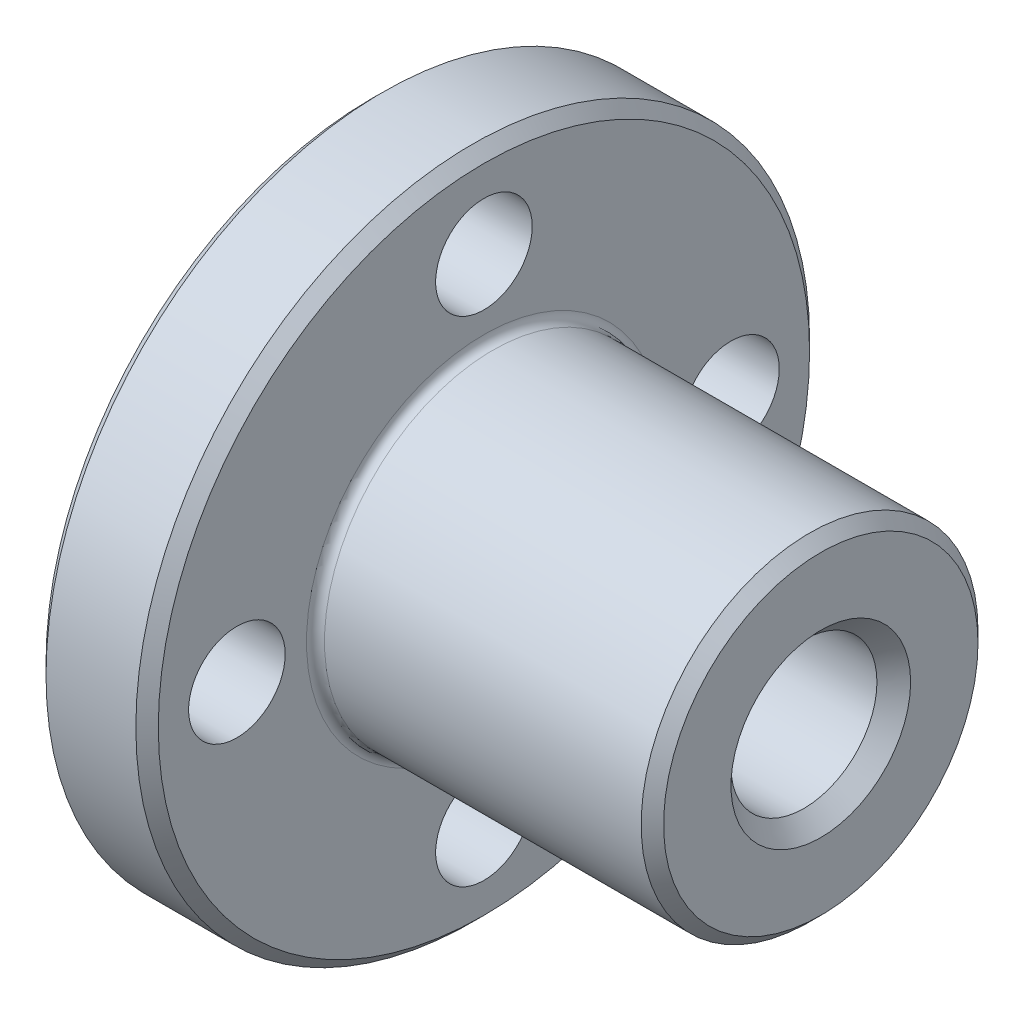
ISO-10303-21;
HEADER;
FILE_DESCRIPTION(('STEP AP214'),'2;1');
FILE_NAME('part.step','',(''),(''),'','','');
FILE_SCHEMA(('AUTOMOTIVE_DESIGN { 1 0 10303 214 1 1 1 1 }'));
ENDSEC;
DATA;
#1=APPLICATION_CONTEXT('core data for automotive mechanical design processes');
#2=APPLICATION_PROTOCOL_DEFINITION('international standard','automotive_design',2000,#1);
#3=PRODUCT_CONTEXT('',#1,'mechanical');
#4=PRODUCT('Part','Part','',(#3));
#5=PRODUCT_RELATED_PRODUCT_CATEGORY('part','',(#4));
#6=PRODUCT_DEFINITION_FORMATION('','',#4);
#7=PRODUCT_DEFINITION_CONTEXT('part definition',#1,'design');
#8=PRODUCT_DEFINITION('design','',#6,#7);
#9=PRODUCT_DEFINITION_SHAPE('','',#8);
#10=(LENGTH_UNIT() NAMED_UNIT(*) SI_UNIT(.MILLI.,.METRE.));
#11=(NAMED_UNIT(*) PLANE_ANGLE_UNIT() SI_UNIT($,.RADIAN.));
#12=(NAMED_UNIT(*) SI_UNIT($,.STERADIAN.) SOLID_ANGLE_UNIT());
#13=UNCERTAINTY_MEASURE_WITH_UNIT(LENGTH_MEASURE(1.E-05),#10,'distance_accuracy_value','');
#14=(GEOMETRIC_REPRESENTATION_CONTEXT(3) GLOBAL_UNCERTAINTY_ASSIGNED_CONTEXT((#13)) GLOBAL_UNIT_ASSIGNED_CONTEXT((#10,
#11,#12)) REPRESENTATION_CONTEXT('',''));
#15=CARTESIAN_POINT('',(0.,0.,0.));
#16=DIRECTION('',(0.,0.,1.));
#17=DIRECTION('',(1.,0.,0.));
#18=AXIS2_PLACEMENT_3D('',#15,#16,#17);
#19=CARTESIAN_POINT('',(0.,0.,0.));
#20=DIRECTION('',(-1.,0.,0.));
#21=DIRECTION('',(0.,0.,1.));
#22=AXIS2_PLACEMENT_3D('',#19,#20,#21);
#23=PLANE('',#22);
#24=CARTESIAN_POINT('',(0.,0.,0.));
#25=DIRECTION('',(-1.,0.,0.));
#26=DIRECTION('',(0.,0.,1.));
#27=AXIS2_PLACEMENT_3D('',#24,#25,#26);
#28=CIRCLE('',#27,14.5000000000013);
#29=CARTESIAN_POINT('',(0.,0.,14.5000000000013));
#30=VERTEX_POINT('',#29);
#31=EDGE_CURVE('E60',#30,#30,#28,.T.);
#32=ORIENTED_EDGE('',*,*,#31,.T.);
#33=EDGE_LOOP('',(#32));
#34=FACE_BOUND('',#33,.T.);
#35=CARTESIAN_POINT('',(0.,0.,0.));
#36=DIRECTION('',(-1.,0.,0.));
#37=DIRECTION('',(0.,0.,1.));
#38=AXIS2_PLACEMENT_3D('',#35,#36,#37);
#39=CIRCLE('',#38,4.00000000000191);
#40=CARTESIAN_POINT('',(0.,0.,4.00000000000191));
#41=VERTEX_POINT('',#40);
#42=EDGE_CURVE('E69',#41,#41,#39,.F.);
#43=ORIENTED_EDGE('',*,*,#42,.T.);
#44=EDGE_LOOP('',(#43));
#45=FACE_BOUND('',#44,.T.);
#46=CARTESIAN_POINT('',(0.,0.,11.));
#47=DIRECTION('',(1.,0.,0.));
#48=DIRECTION('',(0.,0.,-1.));
#49=AXIS2_PLACEMENT_3D('',#46,#47,#48);
#50=CIRCLE('',#49,2.14999999999999);
#51=CARTESIAN_POINT('',(0.,0.,8.85000000000001));
#52=VERTEX_POINT('',#51);
#53=EDGE_CURVE('E99',#52,#52,#50,.T.);
#54=ORIENTED_EDGE('',*,*,#53,.T.);
#55=EDGE_LOOP('',(#54));
#56=FACE_BOUND('',#55,.T.);
#57=CARTESIAN_POINT('',(0.,0.,-11.));
#58=DIRECTION('',(1.,0.,0.));
#59=DIRECTION('',(0.,0.,-1.));
#60=AXIS2_PLACEMENT_3D('',#57,#58,#59);
#61=CIRCLE('',#60,2.14999999999999);
#62=CARTESIAN_POINT('',(0.,0.,-13.15));
#63=VERTEX_POINT('',#62);
#64=EDGE_CURVE('E93',#63,#63,#61,.T.);
#65=ORIENTED_EDGE('',*,*,#64,.T.);
#66=EDGE_LOOP('',(#65));
#67=FACE_BOUND('',#66,.T.);
#68=CARTESIAN_POINT('',(0.,-11.,0.));
#69=DIRECTION('',(1.,0.,0.));
#70=DIRECTION('',(0.,0.,-1.));
#71=AXIS2_PLACEMENT_3D('',#68,#69,#70);
#72=CIRCLE('',#71,2.14999999999999);
#73=CARTESIAN_POINT('',(0.,-11.,-2.14999999999999));
#74=VERTEX_POINT('',#73);
#75=EDGE_CURVE('E87',#74,#74,#72,.T.);
#76=ORIENTED_EDGE('',*,*,#75,.T.);
#77=EDGE_LOOP('',(#76));
#78=FACE_BOUND('',#77,.T.);
#79=CARTESIAN_POINT('',(0.,11.,0.));
#80=DIRECTION('',(1.,0.,0.));
#81=DIRECTION('',(0.,0.,-1.));
#82=AXIS2_PLACEMENT_3D('',#79,#80,#81);
#83=CIRCLE('',#82,2.14999999999999);
#84=CARTESIAN_POINT('',(0.,11.,-2.14999999999999));
#85=VERTEX_POINT('',#84);
#86=EDGE_CURVE('E81',#85,#85,#83,.T.);
#87=ORIENTED_EDGE('',*,*,#86,.T.);
#88=EDGE_LOOP('',(#87));
#89=FACE_BOUND('',#88,.T.);
#90=ADVANCED_FACE('F37',(#34,#45,#56,#67,#78,#89),#23,.T.);
#91=CARTESIAN_POINT('',(5.,0.,0.));
#92=DIRECTION('',(-1.,0.,0.));
#93=DIRECTION('',(0.,0.,1.));
#94=AXIS2_PLACEMENT_3D('',#91,#92,#93);
#95=CYLINDRICAL_SURFACE('',#94,15.);
#96=CARTESIAN_POINT('',(0.500000000001295,0.,0.));
#97=DIRECTION('',(-1.,0.,0.));
#98=DIRECTION('',(0.,0.,1.));
#99=AXIS2_PLACEMENT_3D('',#96,#97,#98);
#100=CIRCLE('',#99,15.);
#101=CARTESIAN_POINT('',(0.500000000001295,0.,15.));
#102=VERTEX_POINT('',#101);
#103=EDGE_CURVE('E52',#102,#102,#100,.F.);
#104=ORIENTED_EDGE('',*,*,#103,.T.);
#105=EDGE_LOOP('',(#104));
#106=FACE_BOUND('',#105,.T.);
#107=CARTESIAN_POINT('',(4.50000000000127,0.,0.));
#108=DIRECTION('',(1.,0.,0.));
#109=DIRECTION('',(0.,0.,-1.));
#110=AXIS2_PLACEMENT_3D('',#107,#108,#109);
#111=CIRCLE('',#110,15.);
#112=CARTESIAN_POINT('',(4.50000000000127,0.,-15.));
#113=VERTEX_POINT('',#112);
#114=EDGE_CURVE('E57',#113,#113,#111,.F.);
#115=ORIENTED_EDGE('',*,*,#114,.T.);
#116=EDGE_LOOP('',(#115));
#117=FACE_BOUND('',#116,.T.);
#118=ADVANCED_FACE('F112',(#106,#117),#95,.T.);
#119=CARTESIAN_POINT('',(5.,15.,0.));
#120=DIRECTION('',(1.,0.,0.));
#121=DIRECTION('',(0.,0.,-1.));
#122=AXIS2_PLACEMENT_3D('',#119,#120,#121);
#123=PLANE('',#122);
#124=CARTESIAN_POINT('',(5.,0.,0.));
#125=DIRECTION('',(1.,0.,0.));
#126=DIRECTION('',(0.,0.,-1.));
#127=AXIS2_PLACEMENT_3D('',#124,#125,#126);
#128=CIRCLE('',#127,7.9);
#129=CARTESIAN_POINT('',(5.,0.,-7.9));
#130=VERTEX_POINT('',#129);
#131=EDGE_CURVE('E10',#130,#130,#128,.F.);
#132=ORIENTED_EDGE('',*,*,#131,.T.);
#133=EDGE_LOOP('',(#132));
#134=FACE_BOUND('',#133,.T.);
#135=CARTESIAN_POINT('',(5.,0.,0.));
#136=DIRECTION('',(1.,0.,0.));
#137=DIRECTION('',(0.,0.,-1.));
#138=AXIS2_PLACEMENT_3D('',#135,#136,#137);
#139=CIRCLE('',#138,14.4999999999987);
#140=CARTESIAN_POINT('',(5.,0.,-14.4999999999987));
#141=VERTEX_POINT('',#140);
#142=EDGE_CURVE('E48',#141,#141,#139,.T.);
#143=ORIENTED_EDGE('',*,*,#142,.T.);
#144=EDGE_LOOP('',(#143));
#145=FACE_BOUND('',#144,.T.);
#146=CARTESIAN_POINT('',(5.,0.,11.));
#147=DIRECTION('',(1.,0.,0.));
#148=DIRECTION('',(0.,0.,-1.));
#149=AXIS2_PLACEMENT_3D('',#146,#147,#148);
#150=CIRCLE('',#149,2.14999999999999);
#151=CARTESIAN_POINT('',(5.,0.,8.85000000000001));
#152=VERTEX_POINT('',#151);
#153=EDGE_CURVE('E102',#152,#152,#150,.T.);
#154=ORIENTED_EDGE('',*,*,#153,.F.);
#155=EDGE_LOOP('',(#154));
#156=FACE_BOUND('',#155,.T.);
#157=CARTESIAN_POINT('',(5.,0.,-11.));
#158=DIRECTION('',(1.,0.,0.));
#159=DIRECTION('',(0.,0.,-1.));
#160=AXIS2_PLACEMENT_3D('',#157,#158,#159);
#161=CIRCLE('',#160,2.14999999999999);
#162=CARTESIAN_POINT('',(5.,0.,-13.15));
#163=VERTEX_POINT('',#162);
#164=EDGE_CURVE('E96',#163,#163,#161,.T.);
#165=ORIENTED_EDGE('',*,*,#164,.F.);
#166=EDGE_LOOP('',(#165));
#167=FACE_BOUND('',#166,.T.);
#168=CARTESIAN_POINT('',(5.,-11.,0.));
#169=DIRECTION('',(1.,0.,0.));
#170=DIRECTION('',(0.,0.,-1.));
#171=AXIS2_PLACEMENT_3D('',#168,#169,#170);
#172=CIRCLE('',#171,2.14999999999999);
#173=CARTESIAN_POINT('',(5.,-11.,-2.14999999999999));
#174=VERTEX_POINT('',#173);
#175=EDGE_CURVE('E90',#174,#174,#172,.T.);
#176=ORIENTED_EDGE('',*,*,#175,.F.);
#177=EDGE_LOOP('',(#176));
#178=FACE_BOUND('',#177,.T.);
#179=CARTESIAN_POINT('',(5.,11.,0.));
#180=DIRECTION('',(1.,0.,0.));
#181=DIRECTION('',(0.,0.,-1.));
#182=AXIS2_PLACEMENT_3D('',#179,#180,#181);
#183=CIRCLE('',#182,2.14999999999999);
#184=CARTESIAN_POINT('',(5.,11.,-2.14999999999999));
#185=VERTEX_POINT('',#184);
#186=EDGE_CURVE('E84',#185,#185,#183,.T.);
#187=ORIENTED_EDGE('',*,*,#186,.F.);
#188=EDGE_LOOP('',(#187));
#189=FACE_BOUND('',#188,.T.);
#190=ADVANCED_FACE('F108',(#134,#145,#156,#167,#178,#189),#123,.T.);
#191=CARTESIAN_POINT('',(20.,0.,0.));
#192=DIRECTION('',(-1.,0.,0.));
#193=DIRECTION('',(0.,0.,1.));
#194=AXIS2_PLACEMENT_3D('',#191,#192,#193);
#195=CYLINDRICAL_SURFACE('',#194,7.5);
#196=CARTESIAN_POINT('',(5.4,0.,0.));
#197=DIRECTION('',(1.,0.,0.));
#198=DIRECTION('',(0.,0.,-1.));
#199=AXIS2_PLACEMENT_3D('',#196,#197,#198);
#200=CIRCLE('',#199,7.5);
#201=CARTESIAN_POINT('',(5.4,0.,-7.5));
#202=VERTEX_POINT('',#201);
#203=EDGE_CURVE('E44',#202,#202,#200,.T.);
#204=ORIENTED_EDGE('',*,*,#203,.T.);
#205=EDGE_LOOP('',(#204));
#206=FACE_BOUND('',#205,.T.);
#207=CARTESIAN_POINT('',(19.4999999999987,0.,0.));
#208=DIRECTION('',(1.,0.,0.));
#209=DIRECTION('',(0.,0.,-1.));
#210=AXIS2_PLACEMENT_3D('',#207,#208,#209);
#211=CIRCLE('',#210,7.5);
#212=CARTESIAN_POINT('',(19.4999999999987,0.,-7.5));
#213=VERTEX_POINT('',#212);
#214=EDGE_CURVE('E63',#213,#213,#211,.F.);
#215=ORIENTED_EDGE('',*,*,#214,.T.);
#216=EDGE_LOOP('',(#215));
#217=FACE_BOUND('',#216,.T.);
#218=ADVANCED_FACE('F111',(#206,#217),#195,.T.);
#219=CARTESIAN_POINT('',(20.,0.,0.));
#220=DIRECTION('',(1.,0.,0.));
#221=DIRECTION('',(0.,0.,-1.));
#222=AXIS2_PLACEMENT_3D('',#219,#220,#221);
#223=PLANE('',#222);
#224=CARTESIAN_POINT('',(20.,0.,0.));
#225=DIRECTION('',(1.,0.,0.));
#226=DIRECTION('',(0.,0.,-1.));
#227=AXIS2_PLACEMENT_3D('',#224,#225,#226);
#228=CIRCLE('',#227,7.00000000000128);
#229=CARTESIAN_POINT('',(20.,0.,-7.00000000000128));
#230=VERTEX_POINT('',#229);
#231=EDGE_CURVE('E66',#230,#230,#228,.T.);
#232=ORIENTED_EDGE('',*,*,#231,.T.);
#233=EDGE_LOOP('',(#232));
#234=FACE_BOUND('',#233,.T.);
#235=CARTESIAN_POINT('',(20.,0.,0.));
#236=DIRECTION('',(1.,0.,0.));
#237=DIRECTION('',(0.,0.,-1.));
#238=AXIS2_PLACEMENT_3D('',#235,#236,#237);
#239=CIRCLE('',#238,3.99999999999807);
#240=CARTESIAN_POINT('',(20.,0.,-3.99999999999807));
#241=VERTEX_POINT('',#240);
#242=EDGE_CURVE('E78',#241,#241,#239,.F.);
#243=ORIENTED_EDGE('',*,*,#242,.T.);
#244=EDGE_LOOP('',(#243));
#245=FACE_BOUND('',#244,.T.);
#246=ADVANCED_FACE('F123',(#234,#245),#223,.T.);
#247=CARTESIAN_POINT('',(5.,11.,0.));
#248=DIRECTION('',(1.,0.,0.));
#249=DIRECTION('',(0.,0.,-1.));
#250=AXIS2_PLACEMENT_3D('',#247,#248,#249);
#251=CYLINDRICAL_SURFACE('',#250,2.14999999999999);
#252=ORIENTED_EDGE('',*,*,#86,.F.);
#253=EDGE_LOOP('',(#252));
#254=FACE_BOUND('',#253,.T.);
#255=ORIENTED_EDGE('',*,*,#186,.T.);
#256=EDGE_LOOP('',(#255));
#257=FACE_BOUND('',#256,.T.);
#258=ADVANCED_FACE('F120',(#254,#257),#251,.F.);
#259=CARTESIAN_POINT('',(5.,-11.,0.));
#260=DIRECTION('',(1.,0.,0.));
#261=DIRECTION('',(0.,0.,-1.));
#262=AXIS2_PLACEMENT_3D('',#259,#260,#261);
#263=CYLINDRICAL_SURFACE('',#262,2.14999999999999);
#264=ORIENTED_EDGE('',*,*,#75,.F.);
#265=EDGE_LOOP('',(#264));
#266=FACE_BOUND('',#265,.T.);
#267=ORIENTED_EDGE('',*,*,#175,.T.);
#268=EDGE_LOOP('',(#267));
#269=FACE_BOUND('',#268,.T.);
#270=ADVANCED_FACE('F122',(#266,#269),#263,.F.);
#271=CARTESIAN_POINT('',(5.,0.,-11.));
#272=DIRECTION('',(1.,0.,0.));
#273=DIRECTION('',(0.,0.,-1.));
#274=AXIS2_PLACEMENT_3D('',#271,#272,#273);
#275=CYLINDRICAL_SURFACE('',#274,2.14999999999999);
#276=ORIENTED_EDGE('',*,*,#64,.F.);
#277=EDGE_LOOP('',(#276));
#278=FACE_BOUND('',#277,.T.);
#279=ORIENTED_EDGE('',*,*,#164,.T.);
#280=EDGE_LOOP('',(#279));
#281=FACE_BOUND('',#280,.T.);
#282=ADVANCED_FACE('F130',(#278,#281),#275,.F.);
#283=CARTESIAN_POINT('',(5.,0.,11.));
#284=DIRECTION('',(1.,0.,0.));
#285=DIRECTION('',(0.,0.,-1.));
#286=AXIS2_PLACEMENT_3D('',#283,#284,#285);
#287=CYLINDRICAL_SURFACE('',#286,2.14999999999999);
#288=ORIENTED_EDGE('',*,*,#53,.F.);
#289=EDGE_LOOP('',(#288));
#290=FACE_BOUND('',#289,.T.);
#291=ORIENTED_EDGE('',*,*,#153,.T.);
#292=EDGE_LOOP('',(#291));
#293=FACE_BOUND('',#292,.T.);
#294=ADVANCED_FACE('F106',(#290,#293),#287,.F.);
#295=CARTESIAN_POINT('',(0.,0.,0.));
#296=DIRECTION('',(-1.,0.,0.));
#297=DIRECTION('',(0.,0.,1.));
#298=AXIS2_PLACEMENT_3D('',#295,#296,#297);
#299=CYLINDRICAL_SURFACE('',#298,3.24999999999999);
#300=CARTESIAN_POINT('',(19.2499999999981,0.,0.));
#301=DIRECTION('',(1.,0.,0.));
#302=DIRECTION('',(0.,0.,-1.));
#303=AXIS2_PLACEMENT_3D('',#300,#301,#302);
#304=CIRCLE('',#303,3.24999999999999);
#305=CARTESIAN_POINT('',(19.2499999999981,0.,-3.24999999999998));
#306=VERTEX_POINT('',#305);
#307=EDGE_CURVE('E72',#306,#306,#304,.T.);
#308=ORIENTED_EDGE('',*,*,#307,.T.);
#309=EDGE_LOOP('',(#308));
#310=FACE_BOUND('',#309,.T.);
#311=CARTESIAN_POINT('',(0.749999999998086,0.,0.));
#312=DIRECTION('',(-1.,0.,0.));
#313=DIRECTION('',(0.,0.,1.));
#314=AXIS2_PLACEMENT_3D('',#311,#312,#313);
#315=CIRCLE('',#314,3.24999999999999);
#316=CARTESIAN_POINT('',(0.749999999998086,0.,3.24999999999999));
#317=VERTEX_POINT('',#316);
#318=EDGE_CURVE('E75',#317,#317,#315,.T.);
#319=ORIENTED_EDGE('',*,*,#318,.T.);
#320=EDGE_LOOP('',(#319));
#321=FACE_BOUND('',#320,.T.);
#322=ADVANCED_FACE('F151',(#310,#321),#299,.F.);
#323=CARTESIAN_POINT('',(20.,0.,0.));
#324=DIRECTION('',(1.,0.,0.));
#325=DIRECTION('',(0.,0.,-1.));
#326=AXIS2_PLACEMENT_3D('',#323,#324,#325);
#327=CONICAL_SURFACE('',#326,3.99999999999807,0.785398163394897);
#328=CARTESIAN_POINT('',(19.2499999999981,0.,-3.24999999999998));
#329=CARTESIAN_POINT('',(19.2578124999981,0.,-3.25781249999997));
#330=CARTESIAN_POINT('',(19.2656249999981,0.,-3.26562499999995));
#331=CARTESIAN_POINT('',(19.2812499999982,0.,-3.2812499999999));
#332=CARTESIAN_POINT('',(19.2890624999982,0.,-3.28906249999988));
#333=CARTESIAN_POINT('',(19.3046874999982,0.,-3.30468749999985));
#334=CARTESIAN_POINT('',(19.3124999999982,0.,-3.31249999999982));
#335=CARTESIAN_POINT('',(19.3281249999983,0.,-3.32812499999978));
#336=CARTESIAN_POINT('',(19.3359374999983,0.,-3.33593749999977));
#337=CARTESIAN_POINT('',(19.3515624999983,0.,-3.35156249999973));
#338=CARTESIAN_POINT('',(19.3593749999984,0.,-3.3593749999997));
#339=CARTESIAN_POINT('',(19.3749999999984,0.,-3.37499999999966));
#340=CARTESIAN_POINT('',(19.3828124999984,0.,-3.38281249999964));
#341=CARTESIAN_POINT('',(19.3984374999985,0.,-3.3984374999996));
#342=CARTESIAN_POINT('',(19.4062499999985,0.,-3.40624999999958));
#343=CARTESIAN_POINT('',(19.4218749999985,0.,-3.42187499999955));
#344=CARTESIAN_POINT('',(19.4296874999985,0.,-3.42968749999953));
#345=CARTESIAN_POINT('',(19.4453124999986,0.,-3.44531249999949));
#346=CARTESIAN_POINT('',(19.4531249999986,0.,-3.45312499999946));
#347=CARTESIAN_POINT('',(19.4687499999986,0.,-3.46874999999942));
#348=CARTESIAN_POINT('',(19.4765624999987,0.,-3.4765624999994));
#349=CARTESIAN_POINT('',(19.4921874999987,0.,-3.49218749999936));
#350=CARTESIAN_POINT('',(19.4999999999987,0.,-3.49999999999934));
#351=CARTESIAN_POINT('',(19.5156249999988,0.,-3.51562499999931));
#352=CARTESIAN_POINT('',(19.5234374999988,0.,-3.52343749999929));
#353=CARTESIAN_POINT('',(19.5390624999988,0.,-3.53906249999925));
#354=CARTESIAN_POINT('',(19.5468749999988,0.,-3.54687499999923));
#355=CARTESIAN_POINT('',(19.5624999999989,0.,-3.56249999999919));
#356=CARTESIAN_POINT('',(19.5703124999989,0.,-3.57031249999917));
#357=CARTESIAN_POINT('',(19.5859374999989,0.,-3.58593749999913));
#358=CARTESIAN_POINT('',(19.593749999999,0.,-3.59374999999911));
#359=CARTESIAN_POINT('',(19.609374999999,0.,-3.60937499999907));
#360=CARTESIAN_POINT('',(19.617187499999,0.,-3.61718749999904));
#361=CARTESIAN_POINT('',(19.6328124999991,0.,-3.63281249999901));
#362=CARTESIAN_POINT('',(19.6406249999991,0.,-3.64062499999899));
#363=CARTESIAN_POINT('',(19.6562499999991,0.,-3.65624999999895));
#364=CARTESIAN_POINT('',(19.6640624999991,0.,-3.66406249999893));
#365=CARTESIAN_POINT('',(19.6796874999992,0.,-3.67968749999889));
#366=CARTESIAN_POINT('',(19.6874999999992,0.,-3.68749999999887));
#367=CARTESIAN_POINT('',(19.7031249999992,0.,-3.70312499999883));
#368=CARTESIAN_POINT('',(19.7109374999993,0.,-3.71093749999881));
#369=CARTESIAN_POINT('',(19.7265624999993,0.,-3.72656249999877));
#370=CARTESIAN_POINT('',(19.7343749999993,0.,-3.73437499999875));
#371=CARTESIAN_POINT('',(19.7499999999994,0.,-3.74999999999871));
#372=CARTESIAN_POINT('',(19.7578124999994,0.,-3.75781249999869));
#373=CARTESIAN_POINT('',(19.7734374999994,0.,-3.77343749999865));
#374=CARTESIAN_POINT('',(19.7812499999994,0.,-3.78124999999863));
#375=CARTESIAN_POINT('',(19.7968749999995,0.,-3.79687499999859));
#376=CARTESIAN_POINT('',(19.8046874999995,0.,-3.80468749999857));
#377=CARTESIAN_POINT('',(19.8203124999995,0.,-3.82031249999853));
#378=CARTESIAN_POINT('',(19.8281249999996,0.,-3.82812499999851));
#379=CARTESIAN_POINT('',(19.8437499999996,0.,-3.84374999999847));
#380=CARTESIAN_POINT('',(19.8515624999996,0.,-3.85156249999845));
#381=CARTESIAN_POINT('',(19.8671874999997,0.,-3.86718749999841));
#382=CARTESIAN_POINT('',(19.8749999999997,0.,-3.87499999999839));
#383=CARTESIAN_POINT('',(19.8906249999997,0.,-3.89062499999835));
#384=CARTESIAN_POINT('',(19.8984374999997,0.,-3.89843749999833));
#385=CARTESIAN_POINT('',(19.9140624999998,0.,-3.91406249999829));
#386=CARTESIAN_POINT('',(19.9218749999998,0.,-3.92187499999827));
#387=CARTESIAN_POINT('',(19.9374999999998,0.,-3.93749999999823));
#388=CARTESIAN_POINT('',(19.9453124999999,0.,-3.94531249999821));
#389=CARTESIAN_POINT('',(19.9609374999999,0.,-3.96093749999817));
#390=CARTESIAN_POINT('',(19.9687499999999,0.,-3.96874999999815));
#391=CARTESIAN_POINT('',(19.984375,0.,-3.98437499999811));
#392=CARTESIAN_POINT('',(19.9921875,0.,-3.99218749999809));
#393=CARTESIAN_POINT('',(20.,0.,-3.99999999999807));
#394=B_SPLINE_CURVE_WITH_KNOTS('',3,(#328,#329,#330,#331,#332,#333,#334,#335,#336,#337,#338,
#339,#340,#341,#342,#343,#344,#345,#346,#347,#348,#349,#350,#351,#352,#353,#354,#355,#356,#357,
#358,#359,#360,#361,#362,#363,#364,#365,#366,#367,#368,#369,#370,#371,#372,#373,#374,#375,#376,
#377,#378,#379,#380,#381,#382,#383,#384,#385,#386,#387,#388,#389,#390,#391,#392,#393),
.UNSPECIFIED.,.F.,.F.,(4,2,2,2,2,2,2,2,2,2,2,2,2,2,2,2,2,2,2,2,2,2,2,2,2,2,2,2,2,2,2,2,4),(0.,
0.033145630368117,0.0662912607362364,0.0994368911043556,0.132582521472475,0.165728151840594,
0.198873782208714,0.232019412576833,0.265165042944953,0.298310673313072,0.331456303681191,
0.36460193404931,0.39774756441743,0.430893194785549,0.464038825153669,0.497184455521788,
0.530330085889907,0.563475716258024,0.596621346626143,0.629766976994263,0.662912607362382,
0.696058237730501,0.729203868098621,0.76234949846674,0.795495128834859,0.828640759202979,
0.861786389571098,0.894932019939217,0.928077650307337,0.961223280675456,0.994368911043575,
1.02751454141169,1.06066017177981),.UNSPECIFIED.);
#395=EDGE_CURVE('BSEAM147',#306,#241,#394,.T.);
#396=ORIENTED_EDGE('',*,*,#307,.F.);
#397=ORIENTED_EDGE('',*,*,#242,.F.);
#398=ORIENTED_EDGE('',*,*,#395,.T.);
#399=ORIENTED_EDGE('',*,*,#395,.F.);
#400=EDGE_LOOP('',(#396,#398,#397,#399));
#401=FACE_BOUND('',#400,.T.);
#402=ADVANCED_FACE('F147',(#401),#327,.F.);
#403=CARTESIAN_POINT('',(0.749999999998086,0.,0.));
#404=DIRECTION('',(-1.,0.,0.));
#405=DIRECTION('',(0.,0.,1.));
#406=AXIS2_PLACEMENT_3D('',#403,#404,#405);
#407=CONICAL_SURFACE('',#406,3.24999999999999,0.785398163400003);
#408=ORIENTED_EDGE('',*,*,#42,.F.);
#409=EDGE_LOOP('',(#408));
#410=FACE_BOUND('',#409,.T.);
#411=ORIENTED_EDGE('',*,*,#318,.F.);
#412=EDGE_LOOP('',(#411));
#413=FACE_BOUND('',#412,.T.);
#414=ADVANCED_FACE('F150',(#410,#413),#407,.F.);
#415=CARTESIAN_POINT('',(20.,0.,0.));
#416=DIRECTION('',(-1.,0.,0.));
#417=DIRECTION('',(0.,0.,1.));
#418=AXIS2_PLACEMENT_3D('',#415,#416,#417);
#419=CONICAL_SURFACE('',#418,7.00000000000128,0.785398163394888);
#420=ORIENTED_EDGE('',*,*,#214,.F.);
#421=EDGE_LOOP('',(#420));
#422=FACE_BOUND('',#421,.T.);
#423=ORIENTED_EDGE('',*,*,#231,.F.);
#424=EDGE_LOOP('',(#423));
#425=FACE_BOUND('',#424,.T.);
#426=ADVANCED_FACE('F155',(#422,#425),#419,.T.);
#427=CARTESIAN_POINT('',(0.,0.,0.));
#428=DIRECTION('',(1.,0.,0.));
#429=DIRECTION('',(0.,0.,-1.));
#430=AXIS2_PLACEMENT_3D('',#427,#428,#429);
#431=CONICAL_SURFACE('',#430,14.5000000000013,0.785398163394891);
#432=ORIENTED_EDGE('',*,*,#103,.F.);
#433=EDGE_LOOP('',(#432));
#434=FACE_BOUND('',#433,.T.);
#435=ORIENTED_EDGE('',*,*,#31,.F.);
#436=EDGE_LOOP('',(#435));
#437=FACE_BOUND('',#436,.T.);
#438=ADVANCED_FACE('F159',(#434,#437),#431,.T.);
#439=CARTESIAN_POINT('',(4.50000000000127,0.,0.));
#440=DIRECTION('',(-1.,0.,0.));
#441=DIRECTION('',(0.,0.,1.));
#442=AXIS2_PLACEMENT_3D('',#439,#440,#441);
#443=CONICAL_SURFACE('',#442,15.,0.785398163400002);
#444=ORIENTED_EDGE('',*,*,#142,.F.);
#445=EDGE_LOOP('',(#444));
#446=FACE_BOUND('',#445,.T.);
#447=ORIENTED_EDGE('',*,*,#114,.F.);
#448=EDGE_LOOP('',(#447));
#449=FACE_BOUND('',#448,.T.);
#450=ADVANCED_FACE('F162',(#446,#449),#443,.T.);
#451=CARTESIAN_POINT('',(5.4,0.,0.));
#452=DIRECTION('',(1.,0.,0.));
#453=DIRECTION('',(0.,0.,-1.));
#454=AXIS2_PLACEMENT_3D('',#451,#452,#453);
#455=TOROIDAL_SURFACE('',#454,7.9,0.4);
#456=ORIENTED_EDGE('',*,*,#131,.F.);
#457=EDGE_LOOP('',(#456));
#458=FACE_BOUND('',#457,.T.);
#459=ORIENTED_EDGE('',*,*,#203,.F.);
#460=EDGE_LOOP('',(#459));
#461=FACE_BOUND('',#460,.T.);
#462=ADVANCED_FACE('F39',(#458,#461),#455,.F.);
#463=CLOSED_SHELL('',(#90,#118,#190,#218,#246,#258,#270,#282,#294,#322,#402,#414,#426,#438,#450,#462));
#464=MANIFOLD_SOLID_BREP('B2',#463);
#465=ADVANCED_BREP_SHAPE_REPRESENTATION('',(#18,#464),#14);
#466=SHAPE_DEFINITION_REPRESENTATION(#9,#465);
ENDSEC;
END-ISO-10303-21;
